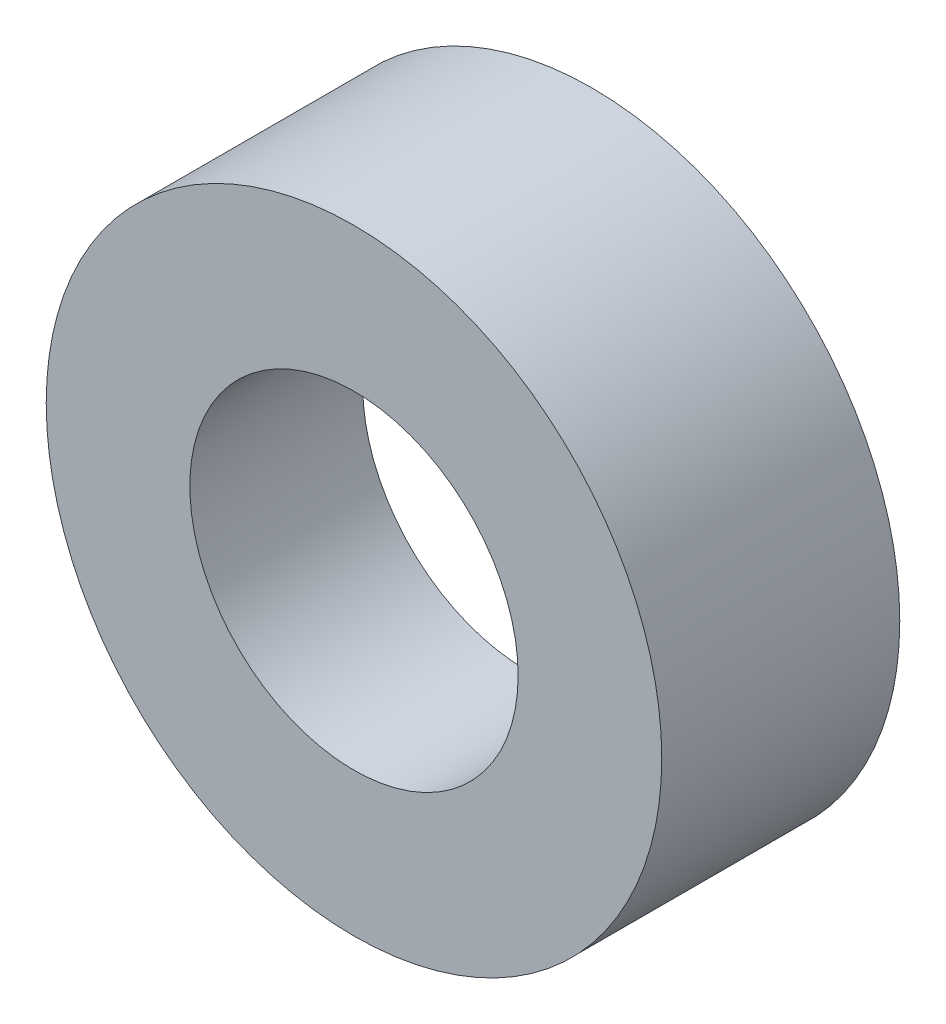
ISO-10303-21;
HEADER;
FILE_DESCRIPTION(('STEP AP214'),'2;1');
FILE_NAME('part.step','',(''),(''),'','','');
FILE_SCHEMA(('AUTOMOTIVE_DESIGN { 1 0 10303 214 1 1 1 1 }'));
ENDSEC;
DATA;
#1=APPLICATION_CONTEXT('core data for automotive mechanical design processes');
#2=APPLICATION_PROTOCOL_DEFINITION('international standard','automotive_design',2000,#1);
#3=PRODUCT_CONTEXT('',#1,'mechanical');
#4=PRODUCT('Part','Part','',(#3));
#5=PRODUCT_RELATED_PRODUCT_CATEGORY('part','',(#4));
#6=PRODUCT_DEFINITION_FORMATION('','',#4);
#7=PRODUCT_DEFINITION_CONTEXT('part definition',#1,'design');
#8=PRODUCT_DEFINITION('design','',#6,#7);
#9=PRODUCT_DEFINITION_SHAPE('','',#8);
#10=(LENGTH_UNIT() NAMED_UNIT(*) SI_UNIT(.MILLI.,.METRE.));
#11=(NAMED_UNIT(*) PLANE_ANGLE_UNIT() SI_UNIT($,.RADIAN.));
#12=(NAMED_UNIT(*) SI_UNIT($,.STERADIAN.) SOLID_ANGLE_UNIT());
#13=UNCERTAINTY_MEASURE_WITH_UNIT(LENGTH_MEASURE(1.E-05),#10,'distance_accuracy_value','');
#14=(GEOMETRIC_REPRESENTATION_CONTEXT(3) GLOBAL_UNCERTAINTY_ASSIGNED_CONTEXT((#13)) GLOBAL_UNIT_ASSIGNED_CONTEXT((#10,
#11,#12)) REPRESENTATION_CONTEXT('',''));
#15=CARTESIAN_POINT('',(0.,0.,0.));
#16=DIRECTION('',(0.,0.,1.));
#17=DIRECTION('',(1.,0.,0.));
#18=AXIS2_PLACEMENT_3D('',#15,#16,#17);
#19=CARTESIAN_POINT('',(85.2065274133614,-1.76399781545092,0.));
#20=DIRECTION('',(0.,0.,1.));
#21=DIRECTION('',(1.,0.,0.));
#22=AXIS2_PLACEMENT_3D('',#19,#20,#21);
#23=CYLINDRICAL_SURFACE('',#22,4.00000000000001);
#24=CARTESIAN_POINT('',(85.2065274133614,-1.76399781545092,5.8));
#25=DIRECTION('',(0.,0.,1.));
#26=DIRECTION('',(1.,0.,0.));
#27=AXIS2_PLACEMENT_3D('',#24,#25,#26);
#28=CIRCLE('',#27,4.00000000000001);
#29=CARTESIAN_POINT('',(89.2065274133614,-1.76399781545092,5.8));
#30=VERTEX_POINT('',#29);
#31=EDGE_CURVE('E54',#30,#30,#28,.T.);
#32=ORIENTED_EDGE('',*,*,#31,.T.);
#33=EDGE_LOOP('',(#32));
#34=FACE_BOUND('',#33,.T.);
#35=CARTESIAN_POINT('',(85.2065274133614,-1.76399781545092,1.5875));
#36=DIRECTION('',(0.,0.,-1.));
#37=DIRECTION('',(-1.,0.,0.));
#38=AXIS2_PLACEMENT_3D('',#35,#36,#37);
#39=CIRCLE('',#38,4.00000000000001);
#40=CARTESIAN_POINT('',(81.2065274133614,-1.76399781545092,1.5875));
#41=VERTEX_POINT('',#40);
#42=EDGE_CURVE('E43',#41,#41,#39,.F.);
#43=ORIENTED_EDGE('',*,*,#42,.F.);
#44=EDGE_LOOP('',(#43));
#45=FACE_BOUND('',#44,.T.);
#46=ADVANCED_FACE('F39',(#34,#45),#23,.F.);
#47=CARTESIAN_POINT('',(85.2065274133614,-1.76399781545092,5.8));
#48=DIRECTION('',(0.,0.,-1.));
#49=DIRECTION('',(-1.,0.,0.));
#50=AXIS2_PLACEMENT_3D('',#47,#48,#49);
#51=CYLINDRICAL_SURFACE('',#50,7.5);
#52=CARTESIAN_POINT('',(85.2065274133614,-1.76399781545092,5.8));
#53=DIRECTION('',(0.,0.,1.));
#54=DIRECTION('',(1.,0.,0.));
#55=AXIS2_PLACEMENT_3D('',#52,#53,#54);
#56=CIRCLE('',#55,7.5);
#57=CARTESIAN_POINT('',(92.7065274133614,-1.76399781545092,5.8));
#58=VERTEX_POINT('',#57);
#59=EDGE_CURVE('E10',#58,#58,#56,.T.);
#60=ORIENTED_EDGE('',*,*,#59,.F.);
#61=EDGE_LOOP('',(#60));
#62=FACE_BOUND('',#61,.T.);
#63=CARTESIAN_POINT('',(85.2065274133614,-1.76399781545092,0.));
#64=DIRECTION('',(0.,0.,1.));
#65=DIRECTION('',(1.,0.,0.));
#66=AXIS2_PLACEMENT_3D('',#63,#64,#65);
#67=CIRCLE('',#66,7.5);
#68=CARTESIAN_POINT('',(92.7065274133614,-1.76399781545092,0.));
#69=VERTEX_POINT('',#68);
#70=EDGE_CURVE('E48',#69,#69,#67,.T.);
#71=ORIENTED_EDGE('',*,*,#70,.T.);
#72=EDGE_LOOP('',(#71));
#73=FACE_BOUND('',#72,.T.);
#74=ADVANCED_FACE('F41',(#62,#73),#51,.T.);
#75=CARTESIAN_POINT('',(85.2065274133614,-1.76399781545092,5.8));
#76=DIRECTION('',(0.,0.,1.));
#77=DIRECTION('',(1.,0.,0.));
#78=AXIS2_PLACEMENT_3D('',#75,#76,#77);
#79=PLANE('',#78);
#80=ORIENTED_EDGE('',*,*,#31,.F.);
#81=EDGE_LOOP('',(#80));
#82=FACE_BOUND('',#81,.T.);
#83=ORIENTED_EDGE('',*,*,#59,.T.);
#84=EDGE_LOOP('',(#83));
#85=FACE_BOUND('',#84,.T.);
#86=ADVANCED_FACE('F80',(#82,#85),#79,.T.);
#87=CARTESIAN_POINT('',(85.2065274133614,-1.76399781545092,0.));
#88=DIRECTION('',(0.,0.,1.));
#89=DIRECTION('',(1.,0.,0.));
#90=AXIS2_PLACEMENT_3D('',#87,#88,#89);
#91=PLANE('',#90);
#92=CARTESIAN_POINT('',(85.2065274133614,-1.76399781545092,0.));
#93=DIRECTION('',(0.,0.,-1.));
#94=DIRECTION('',(-1.,0.,0.));
#95=AXIS2_PLACEMENT_3D('',#92,#93,#94);
#96=CIRCLE('',#95,6.3);
#97=CARTESIAN_POINT('',(78.9065274133614,-1.76399781545092,0.));
#98=VERTEX_POINT('',#97);
#99=EDGE_CURVE('E59',#98,#98,#96,.T.);
#100=ORIENTED_EDGE('',*,*,#99,.F.);
#101=EDGE_LOOP('',(#100));
#102=FACE_BOUND('',#101,.T.);
#103=ORIENTED_EDGE('',*,*,#70,.F.);
#104=EDGE_LOOP('',(#103));
#105=FACE_BOUND('',#104,.T.);
#106=ADVANCED_FACE('F87',(#102,#105),#91,.F.);
#107=CARTESIAN_POINT('',(85.2065274133614,-1.76399781545092,1.5875));
#108=DIRECTION('',(0.,0.,-1.));
#109=DIRECTION('',(-1.,0.,0.));
#110=AXIS2_PLACEMENT_3D('',#107,#108,#109);
#111=PLANE('',#110);
#112=CARTESIAN_POINT('',(85.2065274133614,-1.76399781545092,1.5875));
#113=DIRECTION('',(0.,0.,-1.));
#114=DIRECTION('',(-1.,0.,0.));
#115=AXIS2_PLACEMENT_3D('',#112,#113,#114);
#116=CIRCLE('',#115,6.3);
#117=CARTESIAN_POINT('',(78.9065274133614,-1.76399781545092,1.5875));
#118=VERTEX_POINT('',#117);
#119=EDGE_CURVE('E63',#118,#118,#116,.T.);
#120=ORIENTED_EDGE('',*,*,#119,.T.);
#121=EDGE_LOOP('',(#120));
#122=FACE_BOUND('',#121,.T.);
#123=ORIENTED_EDGE('',*,*,#42,.T.);
#124=EDGE_LOOP('',(#123));
#125=FACE_BOUND('',#124,.T.);
#126=ADVANCED_FACE('F72',(#122,#125),#111,.T.);
#127=CARTESIAN_POINT('',(85.2065274133614,-1.76399781545092,1.5875));
#128=DIRECTION('',(0.,0.,-1.));
#129=DIRECTION('',(-1.,0.,0.));
#130=AXIS2_PLACEMENT_3D('',#127,#128,#129);
#131=CYLINDRICAL_SURFACE('',#130,6.3);
#132=ORIENTED_EDGE('',*,*,#119,.F.);
#133=EDGE_LOOP('',(#132));
#134=FACE_BOUND('',#133,.T.);
#135=ORIENTED_EDGE('',*,*,#99,.T.);
#136=EDGE_LOOP('',(#135));
#137=FACE_BOUND('',#136,.T.);
#138=ADVANCED_FACE('F84',(#134,#137),#131,.F.);
#139=CLOSED_SHELL('',(#46,#74,#86,#106,#126,#138));
#140=MANIFOLD_SOLID_BREP('B2',#139);
#141=ADVANCED_BREP_SHAPE_REPRESENTATION('',(#18,#140),#14);
#142=SHAPE_DEFINITION_REPRESENTATION(#9,#141);
ENDSEC;
END-ISO-10303-21;
